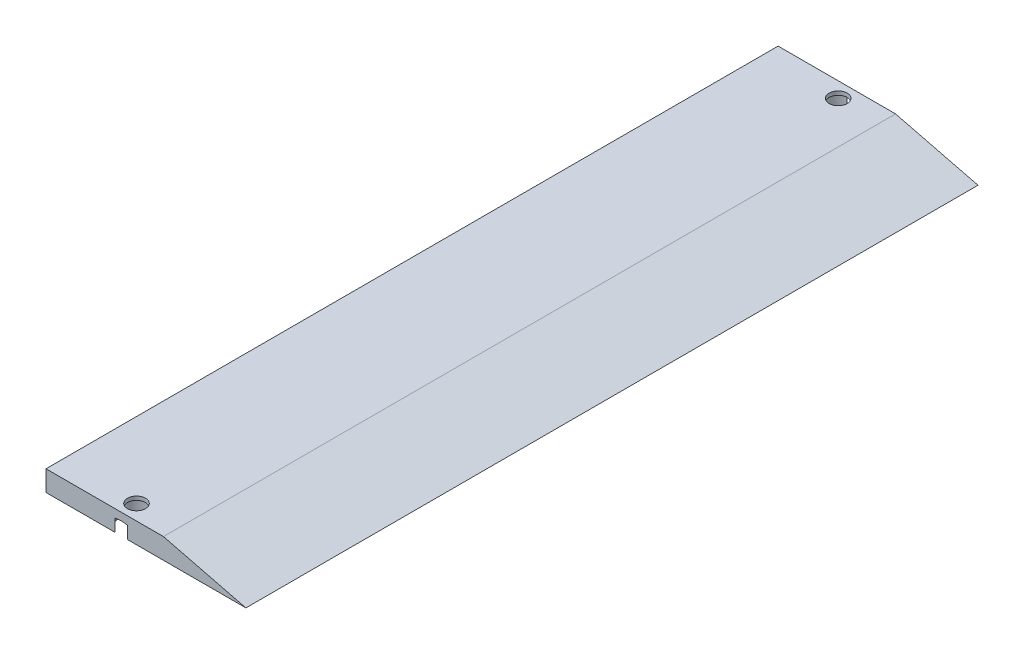
ISO-10303-21;
HEADER;
FILE_DESCRIPTION(('STEP AP214'),'2;1');
FILE_NAME('part.step','',(''),(''),'','','');
FILE_SCHEMA(('AUTOMOTIVE_DESIGN { 1 0 10303 214 1 1 1 1 }'));
ENDSEC;
DATA;
#1=APPLICATION_CONTEXT('core data for automotive mechanical design processes');
#2=APPLICATION_PROTOCOL_DEFINITION('international standard','automotive_design',2000,#1);
#3=PRODUCT_CONTEXT('',#1,'mechanical');
#4=PRODUCT('Part','Part','',(#3));
#5=PRODUCT_RELATED_PRODUCT_CATEGORY('part','',(#4));
#6=PRODUCT_DEFINITION_FORMATION('','',#4);
#7=PRODUCT_DEFINITION_CONTEXT('part definition',#1,'design');
#8=PRODUCT_DEFINITION('design','',#6,#7);
#9=PRODUCT_DEFINITION_SHAPE('','',#8);
#10=(LENGTH_UNIT() NAMED_UNIT(*) SI_UNIT(.MILLI.,.METRE.));
#11=(NAMED_UNIT(*) PLANE_ANGLE_UNIT() SI_UNIT($,.RADIAN.));
#12=(NAMED_UNIT(*) SI_UNIT($,.STERADIAN.) SOLID_ANGLE_UNIT());
#13=UNCERTAINTY_MEASURE_WITH_UNIT(LENGTH_MEASURE(1.E-05),#10,'distance_accuracy_value','');
#14=(GEOMETRIC_REPRESENTATION_CONTEXT(3) GLOBAL_UNCERTAINTY_ASSIGNED_CONTEXT((#13)) GLOBAL_UNIT_ASSIGNED_CONTEXT((#10,
#11,#12)) REPRESENTATION_CONTEXT('',''));
#15=CARTESIAN_POINT('',(0.,0.,0.));
#16=DIRECTION('',(0.,0.,1.));
#17=DIRECTION('',(1.,0.,0.));
#18=AXIS2_PLACEMENT_3D('',#15,#16,#17);
#19=CARTESIAN_POINT('',(24.3,0.,44.5));
#20=DIRECTION('',(0.,1.,0.));
#21=DIRECTION('',(-1.,0.,0.));
#22=AXIS2_PLACEMENT_3D('',#19,#20,#21);
#23=PLANE('',#22);
#24=CARTESIAN_POINT('',(9.15,0.,42.65));
#25=DIRECTION('',(0.,-1.,0.));
#26=DIRECTION('',(0.,0.,-1.));
#27=AXIS2_PLACEMENT_3D('',#24,#25,#26);
#28=CIRCLE('',#27,2.);
#29=CARTESIAN_POINT('',(8.39006579232145,0.,44.5));
#30=VERTEX_POINT('',#29);
#31=CARTESIAN_POINT('',(9.90993420767854,0.,44.5));
#32=VERTEX_POINT('',#31);
#33=EDGE_CURVE('E108',#30,#32,#28,.T.);
#34=ORIENTED_EDGE('',*,*,#33,.F.);
#35=DIRECTION('',(1.,0.,0.));
#36=VECTOR('',#35,1.);
#37=CARTESIAN_POINT('',(24.3,0.,44.5));
#38=LINE('',#37,#36);
#39=CARTESIAN_POINT('',(0.,0.,44.5));
#40=VERTEX_POINT('',#39);
#41=EDGE_CURVE('E113',#40,#30,#38,.T.);
#42=ORIENTED_EDGE('',*,*,#41,.F.);
#43=DIRECTION('',(0.,0.,-1.));
#44=VECTOR('',#43,1.);
#45=CARTESIAN_POINT('',(0.,0.,44.5));
#46=LINE('',#45,#44);
#47=CARTESIAN_POINT('',(0.,0.,-44.5));
#48=VERTEX_POINT('',#47);
#49=EDGE_CURVE('E199',#40,#48,#46,.T.);
#50=ORIENTED_EDGE('',*,*,#49,.T.);
#51=DIRECTION('',(1.,0.,0.));
#52=VECTOR('',#51,1.);
#53=CARTESIAN_POINT('',(24.3,0.,-44.5));
#54=LINE('',#53,#52);
#55=CARTESIAN_POINT('',(8.39006579232145,0.,-44.5));
#56=VERTEX_POINT('',#55);
#57=EDGE_CURVE('E183',#48,#56,#54,.T.);
#58=ORIENTED_EDGE('',*,*,#57,.T.);
#59=CARTESIAN_POINT('',(9.15,0.,-42.65));
#60=DIRECTION('',(0.,-1.,0.));
#61=DIRECTION('',(0.,0.,-1.));
#62=AXIS2_PLACEMENT_3D('',#59,#60,#61);
#63=CIRCLE('',#62,2.);
#64=CARTESIAN_POINT('',(9.90993420767854,0.,-44.5));
#65=VERTEX_POINT('',#64);
#66=EDGE_CURVE('E230',#65,#56,#63,.T.);
#67=ORIENTED_EDGE('',*,*,#66,.F.);
#68=CARTESIAN_POINT('',(24.3,0.,-44.5));
#69=VERTEX_POINT('',#68);
#70=EDGE_CURVE('E210',#65,#69,#54,.T.);
#71=ORIENTED_EDGE('',*,*,#70,.T.);
#72=DIRECTION('',(0.,0.,-1.));
#73=VECTOR('',#72,1.);
#74=CARTESIAN_POINT('',(24.3,0.,44.5));
#75=LINE('',#74,#73);
#76=CARTESIAN_POINT('',(24.3,0.,44.5));
#77=VERTEX_POINT('',#76);
#78=EDGE_CURVE('E150',#77,#69,#75,.T.);
#79=ORIENTED_EDGE('',*,*,#78,.F.);
#80=EDGE_CURVE('E195',#32,#77,#38,.T.);
#81=ORIENTED_EDGE('',*,*,#80,.F.);
#82=EDGE_LOOP('',(#34,#42,#50,#58,#67,#71,#79,#81));
#83=FACE_BOUND('',#82,.T.);
#84=ADVANCED_FACE('F36',(#83),#23,.F.);
#85=CARTESIAN_POINT('',(14.2730476661604,2.5,44.5));
#86=DIRECTION('',(-0.241921895599668,-0.970295726275996,0.));
#87=DIRECTION('',(0.970295726275996,-0.241921895599668,0.));
#88=AXIS2_PLACEMENT_3D('',#85,#86,#87);
#89=PLANE('',#88);
#90=DIRECTION('',(-0.970295726275996,0.241921895599668,0.));
#91=VECTOR('',#90,1.);
#92=CARTESIAN_POINT('',(14.2730476661604,2.5,-44.5));
#93=LINE('',#92,#91);
#94=CARTESIAN_POINT('',(14.2730476661604,2.5,-44.5));
#95=VERTEX_POINT('',#94);
#96=EDGE_CURVE('E174',#69,#95,#93,.T.);
#97=ORIENTED_EDGE('',*,*,#96,.T.);
#98=DIRECTION('',(0.,0.,-1.));
#99=VECTOR('',#98,1.);
#100=CARTESIAN_POINT('',(14.2730476661604,2.5,44.5));
#101=LINE('',#100,#99);
#102=CARTESIAN_POINT('',(14.2730476661604,2.5,44.5));
#103=VERTEX_POINT('',#102);
#104=EDGE_CURVE('E177',#103,#95,#101,.T.);
#105=ORIENTED_EDGE('',*,*,#104,.F.);
#106=DIRECTION('',(-0.970295726275996,0.241921895599668,0.));
#107=VECTOR('',#106,1.);
#108=CARTESIAN_POINT('',(14.2730476661604,2.5,44.5));
#109=LINE('',#108,#107);
#110=EDGE_CURVE('E206',#77,#103,#109,.T.);
#111=ORIENTED_EDGE('',*,*,#110,.F.);
#112=ORIENTED_EDGE('',*,*,#78,.T.);
#113=EDGE_LOOP('',(#97,#105,#111,#112));
#114=FACE_BOUND('',#113,.T.);
#115=ADVANCED_FACE('F163',(#114),#89,.F.);
#116=CARTESIAN_POINT('',(0.,2.5,44.5));
#117=DIRECTION('',(0.,-1.,0.));
#118=DIRECTION('',(1.,0.,0.));
#119=AXIS2_PLACEMENT_3D('',#116,#117,#118);
#120=PLANE('',#119);
#121=CARTESIAN_POINT('',(9.15,2.5,42.65));
#122=DIRECTION('',(0.,-1.,0.));
#123=DIRECTION('',(1.,0.,0.));
#124=AXIS2_PLACEMENT_3D('',#121,#122,#123);
#125=CIRCLE('',#124,1.1);
#126=CARTESIAN_POINT('',(10.25,2.5,42.65));
#127=VERTEX_POINT('',#126);
#128=EDGE_CURVE('E227',#127,#127,#125,.T.);
#129=ORIENTED_EDGE('',*,*,#128,.T.);
#130=EDGE_LOOP('',(#129));
#131=FACE_BOUND('',#130,.T.);
#132=CARTESIAN_POINT('',(9.15,2.5,-42.65));
#133=DIRECTION('',(0.,-1.,0.));
#134=DIRECTION('',(1.,0.,0.));
#135=AXIS2_PLACEMENT_3D('',#132,#133,#134);
#136=CIRCLE('',#135,1.1);
#137=CARTESIAN_POINT('',(10.25,2.5,-42.65));
#138=VERTEX_POINT('',#137);
#139=EDGE_CURVE('E212',#138,#138,#136,.T.);
#140=ORIENTED_EDGE('',*,*,#139,.T.);
#141=EDGE_LOOP('',(#140));
#142=FACE_BOUND('',#141,.T.);
#143=DIRECTION('',(-1.,0.,0.));
#144=VECTOR('',#143,1.);
#145=CARTESIAN_POINT('',(0.,2.5,-44.5));
#146=LINE('',#145,#144);
#147=CARTESIAN_POINT('',(0.,2.5,-44.5));
#148=VERTEX_POINT('',#147);
#149=EDGE_CURVE('E182',#95,#148,#146,.T.);
#150=ORIENTED_EDGE('',*,*,#149,.T.);
#151=DIRECTION('',(0.,0.,-1.));
#152=VECTOR('',#151,1.);
#153=CARTESIAN_POINT('',(0.,2.5,44.5));
#154=LINE('',#153,#152);
#155=CARTESIAN_POINT('',(0.,2.5,44.5));
#156=VERTEX_POINT('',#155);
#157=EDGE_CURVE('E189',#156,#148,#154,.T.);
#158=ORIENTED_EDGE('',*,*,#157,.F.);
#159=DIRECTION('',(-1.,0.,0.));
#160=VECTOR('',#159,1.);
#161=CARTESIAN_POINT('',(0.,2.5,44.5));
#162=LINE('',#161,#160);
#163=EDGE_CURVE('E188',#103,#156,#162,.T.);
#164=ORIENTED_EDGE('',*,*,#163,.F.);
#165=ORIENTED_EDGE('',*,*,#104,.T.);
#166=EDGE_LOOP('',(#150,#158,#164,#165));
#167=FACE_BOUND('',#166,.T.);
#168=ADVANCED_FACE('F160',(#131,#142,#167),#120,.F.);
#169=CARTESIAN_POINT('',(0.,0.,44.5));
#170=DIRECTION('',(1.,0.,0.));
#171=DIRECTION('',(0.,0.,-1.));
#172=AXIS2_PLACEMENT_3D('',#169,#170,#171);
#173=PLANE('',#172);
#174=DIRECTION('',(0.,-1.,0.));
#175=VECTOR('',#174,1.);
#176=CARTESIAN_POINT('',(0.,0.,-44.5));
#177=LINE('',#176,#175);
#178=EDGE_CURVE('E193',#148,#48,#177,.T.);
#179=ORIENTED_EDGE('',*,*,#178,.T.);
#180=ORIENTED_EDGE('',*,*,#49,.F.);
#181=DIRECTION('',(0.,-1.,0.));
#182=VECTOR('',#181,1.);
#183=CARTESIAN_POINT('',(0.,0.,44.5));
#184=LINE('',#183,#182);
#185=EDGE_CURVE('E202',#156,#40,#184,.T.);
#186=ORIENTED_EDGE('',*,*,#185,.F.);
#187=ORIENTED_EDGE('',*,*,#157,.T.);
#188=EDGE_LOOP('',(#179,#180,#186,#187));
#189=FACE_BOUND('',#188,.T.);
#190=ADVANCED_FACE('F157',(#189),#173,.F.);
#191=CARTESIAN_POINT('',(0.,0.,44.5));
#192=DIRECTION('',(0.,0.,-1.));
#193=DIRECTION('',(-1.,0.,0.));
#194=AXIS2_PLACEMENT_3D('',#191,#192,#193);
#195=PLANE('',#194);
#196=CARTESIAN_POINT('',(6.59444238548207,0.806067907899815,44.5));
#197=CARTESIAN_POINT('',(6.6682645925823,0.841987536418596,44.5));
#198=CARTESIAN_POINT('',(6.7422923801491,0.877492518891963,44.5));
#199=CARTESIAN_POINT('',(6.89086107584432,0.947450063041663,44.5));
#200=CARTESIAN_POINT('',(6.96540208392856,0.981902412167576,44.5));
#201=CARTESIAN_POINT('',(7.11552606471736,1.04972316517353,44.5));
#202=CARTESIAN_POINT('',(7.19111261964096,1.08308367608442,44.5));
#203=CARTESIAN_POINT('',(7.34298026279594,1.14817569987937,44.5));
#204=CARTESIAN_POINT('',(7.41926131283884,1.17990730170351,44.5));
#205=CARTESIAN_POINT('',(7.57417174488263,1.24194735074,44.5));
#206=CARTESIAN_POINT('',(7.65281767325495,1.2722149998071,44.5));
#207=CARTESIAN_POINT('',(7.81108731294135,1.33006740940165,44.5));
#208=CARTESIAN_POINT('',(7.89071113507037,1.35765186265018,44.5));
#209=CARTESIAN_POINT('',(8.1308956011947,1.43522494455478,44.5));
#210=CARTESIAN_POINT('',(8.29320139498514,1.48021428056957,44.5));
#211=CARTESIAN_POINT('',(8.54646274004633,1.53353303693847,44.5));
#212=CARTESIAN_POINT('',(8.63586657377305,1.54920451548702,44.5));
#213=CARTESIAN_POINT('',(8.81566336213668,1.57334845963417,44.5));
#214=CARTESIAN_POINT('',(8.90605621485068,1.58182166010068,44.5));
#215=CARTESIAN_POINT('',(9.08622469975676,1.59076121335444,44.5));
#216=CARTESIAN_POINT('',(9.17599578946092,1.59131682336556,44.5));
#217=CARTESIAN_POINT('',(9.35524526981166,1.58460377310746,44.5));
#218=CARTESIAN_POINT('',(9.44472361659146,1.57733398965401,44.5));
#219=CARTESIAN_POINT('',(9.66358111852635,1.5506168392289,44.5));
#220=CARTESIAN_POINT('',(9.7924627475032,1.52711671576831,44.5));
#221=CARTESIAN_POINT('',(10.0474922796653,1.46827150248723,44.5));
#222=CARTESIAN_POINT('',(10.1736373958245,1.43291488962221,44.5));
#223=CARTESIAN_POINT('',(10.3623201051773,1.37311372311389,44.5));
#224=CARTESIAN_POINT('',(10.4258713288542,1.35175855272218,44.5));
#225=CARTESIAN_POINT('',(10.5523277071677,1.30720740948195,44.5));
#226=CARTESIAN_POINT('',(10.6152328562462,1.28401142081179,44.5));
#227=CARTESIAN_POINT('',(10.7404336144126,1.23610775500023,44.5));
#228=CARTESIAN_POINT('',(10.8027294458913,1.21140065523917,44.5));
#229=CARTESIAN_POINT('',(10.9267996975924,1.16072112966394,44.5));
#230=CARTESIAN_POINT('',(10.9885741383714,1.13474875401136,44.5));
#231=CARTESIAN_POINT('',(11.2032967424494,1.04231897698155,44.5));
#232=CARTESIAN_POINT('',(11.355076679947,0.973149165263977,44.5));
#233=CARTESIAN_POINT('',(11.6566631609112,0.830617009352424,44.5));
#234=CARTESIAN_POINT('',(11.8064692838507,0.757253788960367,44.5));
#235=CARTESIAN_POINT('',(12.1047324194077,0.607637131990832,44.5));
#236=CARTESIAN_POINT('',(12.253188622555,0.531382086967987,44.5));
#237=CARTESIAN_POINT('',(12.5490568063834,0.376868105969787,44.5));
#238=CARTESIAN_POINT('',(12.6964687482323,0.298609095968617,44.5));
#239=CARTESIAN_POINT('',(12.9908191140464,0.140472839545878,44.5));
#240=CARTESIAN_POINT('',(13.1377558960653,0.0605925429348834,44.5));
#241=CARTESIAN_POINT('',(13.4310316509055,-0.100259077095215,44.5));
#242=CARTESIAN_POINT('',(13.5773706184478,-0.181230410121667,44.5));
#243=CARTESIAN_POINT('',(14.015596097537,-0.425318798115221,44.5));
#244=CARTESIAN_POINT('',(14.3067962520312,-0.58966722454027,44.5));
#245=CARTESIAN_POINT('',(14.8448337566611,-0.895794407270467,44.5));
#246=CARTESIAN_POINT('',(15.0918296388874,-1.03729569465513,44.5));
#247=CARTESIAN_POINT('',(15.5852500642677,-1.32135089141933,44.5));
#248=CARTESIAN_POINT('',(15.8316745443308,-1.46390491038304,44.5));
#249=CARTESIAN_POINT('',(16.3231603592293,-1.74922120452498,44.5));
#250=CARTESIAN_POINT('',(16.5682233296152,-1.89198066562047,44.5));
#251=CARTESIAN_POINT('',(17.0579895901374,-2.17805114711455,44.5));
#252=CARTESIAN_POINT('',(17.3026929182433,-2.32136210248978,44.5));
#253=CARTESIAN_POINT('',(17.5472801898519,-2.46487006850865,44.5));
#254=B_SPLINE_CURVE_WITH_KNOTS('',3,(#196,#197,#198,#199,#200,#201,#202,#203,#204,#205,#206,
#207,#208,#209,#210,#211,#212,#213,#214,#215,#216,#217,#218,#219,#220,#221,#222,#223,#224,#225,
#226,#227,#228,#229,#230,#231,#232,#233,#234,#235,#236,#237,#238,#239,#240,#241,#242,#243,#244,
#245,#246,#247,#248,#249,#250,#251,#252,#253),.UNSPECIFIED.,.F.,.F.,(4,2,2,2,2,2,2,2,2,2,2,2,2,
2,2,2,2,2,2,2,2,2,2,2,2,2,2,2,4),(0.,0.246295127205871,0.492639662616952,0.740486724665851,
0.988320239588767,1.24107745765782,1.49386358742656,1.99803295705516,2.27009754075422,
2.54213434620322,2.81110194653903,3.08010815713201,3.47233686454723,3.86494788000543,
4.06605621685199,4.2671662823919,4.46819998012517,4.669225714397,5.16950181411883,
5.66988282963293,6.17054636303702,6.67122841754458,7.17296074563737,7.67469749472953,
8.6778124455629,9.53178108106438,10.3858399000068,11.2366770201399,12.0874167220371),.UNSPECIFIED.);
#255=CARTESIAN_POINT('',(8.39006579232146,1.5,44.5));
#256=VERTEX_POINT('',#255);
#257=CARTESIAN_POINT('',(9.90993420767854,1.5,44.5));
#258=VERTEX_POINT('',#257);
#259=EDGE_CURVE('E98',#256,#258,#254,.T.);
#260=ORIENTED_EDGE('',*,*,#259,.T.);
#261=DIRECTION('',(0.,-1.,0.));
#262=VECTOR('',#261,1.);
#263=CARTESIAN_POINT('',(9.90993420767854,0.,44.5));
#264=LINE('',#263,#262);
#265=EDGE_CURVE('E11',#258,#32,#264,.T.);
#266=ORIENTED_EDGE('',*,*,#265,.T.);
#267=ORIENTED_EDGE('',*,*,#80,.T.);
#268=ORIENTED_EDGE('',*,*,#110,.T.);
#269=ORIENTED_EDGE('',*,*,#163,.T.);
#270=ORIENTED_EDGE('',*,*,#185,.T.);
#271=ORIENTED_EDGE('',*,*,#41,.T.);
#272=DIRECTION('',(0.,-1.,0.));
#273=VECTOR('',#272,1.);
#274=CARTESIAN_POINT('',(8.39006579232146,0.,44.5));
#275=LINE('',#274,#273);
#276=EDGE_CURVE('E43',#30,#256,#275,.F.);
#277=ORIENTED_EDGE('',*,*,#276,.T.);
#278=EDGE_LOOP('',(#260,#266,#267,#268,#269,#270,#271,#277));
#279=FACE_BOUND('',#278,.T.);
#280=ADVANCED_FACE('F111',(#279),#195,.F.);
#281=CARTESIAN_POINT('',(0.,0.,-44.5));
#282=DIRECTION('',(0.,0.,-1.));
#283=DIRECTION('',(-1.,0.,0.));
#284=AXIS2_PLACEMENT_3D('',#281,#282,#283);
#285=PLANE('',#284);
#286=DIRECTION('',(0.,-1.,0.));
#287=VECTOR('',#286,1.);
#288=CARTESIAN_POINT('',(9.90993420767854,0.,-44.5));
#289=LINE('',#288,#287);
#290=CARTESIAN_POINT('',(9.90993420767854,1.5,-44.5));
#291=VERTEX_POINT('',#290);
#292=EDGE_CURVE('E102',#291,#65,#289,.T.);
#293=ORIENTED_EDGE('',*,*,#292,.F.);
#294=CARTESIAN_POINT('',(6.59444238548207,0.806067907899815,-44.5));
#295=CARTESIAN_POINT('',(6.6682645925823,0.841987536418596,-44.5));
#296=CARTESIAN_POINT('',(6.7422923801491,0.877492518891963,-44.5));
#297=CARTESIAN_POINT('',(6.89086107584432,0.947450063041663,-44.5));
#298=CARTESIAN_POINT('',(6.96540208392856,0.981902412167576,-44.5));
#299=CARTESIAN_POINT('',(7.11552606471736,1.04972316517353,-44.5));
#300=CARTESIAN_POINT('',(7.19111261964096,1.08308367608442,-44.5));
#301=CARTESIAN_POINT('',(7.34298026279594,1.14817569987937,-44.5));
#302=CARTESIAN_POINT('',(7.41926131283884,1.17990730170351,-44.5));
#303=CARTESIAN_POINT('',(7.57417174488263,1.24194735074,-44.5));
#304=CARTESIAN_POINT('',(7.65281767325495,1.2722149998071,-44.5));
#305=CARTESIAN_POINT('',(7.81108731294135,1.33006740940165,-44.5));
#306=CARTESIAN_POINT('',(7.89071113507037,1.35765186265018,-44.5));
#307=CARTESIAN_POINT('',(8.1308956011947,1.43522494455478,-44.5));
#308=CARTESIAN_POINT('',(8.29320139498514,1.48021428056957,-44.5));
#309=CARTESIAN_POINT('',(8.54646274004633,1.53353303693847,-44.5));
#310=CARTESIAN_POINT('',(8.63586657377305,1.54920451548702,-44.5));
#311=CARTESIAN_POINT('',(8.81566336213668,1.57334845963417,-44.5));
#312=CARTESIAN_POINT('',(8.90605621485068,1.58182166010068,-44.5));
#313=CARTESIAN_POINT('',(9.08622469975676,1.59076121335444,-44.5));
#314=CARTESIAN_POINT('',(9.17599578946092,1.59131682336556,-44.5));
#315=CARTESIAN_POINT('',(9.35524526981166,1.58460377310746,-44.5));
#316=CARTESIAN_POINT('',(9.44472361659146,1.57733398965401,-44.5));
#317=CARTESIAN_POINT('',(9.66358111852635,1.5506168392289,-44.5));
#318=CARTESIAN_POINT('',(9.7924627475032,1.52711671576831,-44.5));
#319=CARTESIAN_POINT('',(10.0474922796653,1.46827150248723,-44.5));
#320=CARTESIAN_POINT('',(10.1736373958245,1.43291488962221,-44.5));
#321=CARTESIAN_POINT('',(10.3623201051773,1.37311372311389,-44.5));
#322=CARTESIAN_POINT('',(10.4258713288542,1.35175855272218,-44.5));
#323=CARTESIAN_POINT('',(10.5523277071677,1.30720740948195,-44.5));
#324=CARTESIAN_POINT('',(10.6152328562462,1.28401142081179,-44.5));
#325=CARTESIAN_POINT('',(10.7404336144126,1.23610775500023,-44.5));
#326=CARTESIAN_POINT('',(10.8027294458913,1.21140065523917,-44.5));
#327=CARTESIAN_POINT('',(10.9267996975924,1.16072112966394,-44.5));
#328=CARTESIAN_POINT('',(10.9885741383714,1.13474875401136,-44.5));
#329=CARTESIAN_POINT('',(11.2032967424494,1.04231897698155,-44.5));
#330=CARTESIAN_POINT('',(11.355076679947,0.973149165263977,-44.5));
#331=CARTESIAN_POINT('',(11.6566631609112,0.830617009352424,-44.5));
#332=CARTESIAN_POINT('',(11.8064692838507,0.757253788960367,-44.5));
#333=CARTESIAN_POINT('',(12.1047324194077,0.607637131990832,-44.5));
#334=CARTESIAN_POINT('',(12.253188622555,0.531382086967987,-44.5));
#335=CARTESIAN_POINT('',(12.5490568063834,0.376868105969787,-44.5));
#336=CARTESIAN_POINT('',(12.6964687482323,0.298609095968617,-44.5));
#337=CARTESIAN_POINT('',(12.9908191140464,0.140472839545878,-44.5));
#338=CARTESIAN_POINT('',(13.1377558960653,0.0605925429348834,-44.5));
#339=CARTESIAN_POINT('',(13.4310316509055,-0.100259077095215,-44.5));
#340=CARTESIAN_POINT('',(13.5773706184478,-0.181230410121667,-44.5));
#341=CARTESIAN_POINT('',(14.015596097537,-0.425318798115221,-44.5));
#342=CARTESIAN_POINT('',(14.3067962520312,-0.58966722454027,-44.5));
#343=CARTESIAN_POINT('',(14.8448337566611,-0.895794407270467,-44.5));
#344=CARTESIAN_POINT('',(15.0918296388874,-1.03729569465513,-44.5));
#345=CARTESIAN_POINT('',(15.5852500642677,-1.32135089141933,-44.5));
#346=CARTESIAN_POINT('',(15.8316745443308,-1.46390491038304,-44.5));
#347=CARTESIAN_POINT('',(16.3231603592293,-1.74922120452498,-44.5));
#348=CARTESIAN_POINT('',(16.5682233296152,-1.89198066562047,-44.5));
#349=CARTESIAN_POINT('',(17.0579895901374,-2.17805114711455,-44.5));
#350=CARTESIAN_POINT('',(17.3026929182433,-2.32136210248978,-44.5));
#351=CARTESIAN_POINT('',(17.5472801898519,-2.46487006850865,-44.5));
#352=B_SPLINE_CURVE_WITH_KNOTS('',3,(#294,#295,#296,#297,#298,#299,#300,#301,#302,#303,#304,
#305,#306,#307,#308,#309,#310,#311,#312,#313,#314,#315,#316,#317,#318,#319,#320,#321,#322,#323,
#324,#325,#326,#327,#328,#329,#330,#331,#332,#333,#334,#335,#336,#337,#338,#339,#340,#341,#342,
#343,#344,#345,#346,#347,#348,#349,#350,#351),.UNSPECIFIED.,.F.,.F.,(4,2,2,2,2,2,2,2,2,2,2,2,2,
2,2,2,2,2,2,2,2,2,2,2,2,2,2,2,4),(0.,0.246295127205871,0.492639662616952,0.740486724665851,
0.988320239588767,1.24107745765782,1.49386358742656,1.99803295705516,2.27009754075422,
2.54213434620322,2.81110194653903,3.08010815713201,3.47233686454723,3.86494788000543,
4.06605621685199,4.2671662823919,4.46819998012517,4.669225714397,5.16950181411883,
5.66988282963293,6.17054636303702,6.67122841754458,7.17296074563737,7.67469749472953,
8.6778124455629,9.53178108106438,10.3858399000068,11.2366770201399,12.0874167220371),.UNSPECIFIED.);
#353=CARTESIAN_POINT('',(8.39006579232146,1.5,-44.5));
#354=VERTEX_POINT('',#353);
#355=EDGE_CURVE('E143',#354,#291,#352,.T.);
#356=ORIENTED_EDGE('',*,*,#355,.F.);
#357=DIRECTION('',(0.,-1.,0.));
#358=VECTOR('',#357,1.);
#359=CARTESIAN_POINT('',(8.39006579232146,0.,-44.5));
#360=LINE('',#359,#358);
#361=EDGE_CURVE('E149',#56,#354,#360,.F.);
#362=ORIENTED_EDGE('',*,*,#361,.F.);
#363=ORIENTED_EDGE('',*,*,#57,.F.);
#364=ORIENTED_EDGE('',*,*,#178,.F.);
#365=ORIENTED_EDGE('',*,*,#149,.F.);
#366=ORIENTED_EDGE('',*,*,#96,.F.);
#367=ORIENTED_EDGE('',*,*,#70,.F.);
#368=EDGE_LOOP('',(#293,#356,#362,#363,#364,#365,#366,#367));
#369=FACE_BOUND('',#368,.T.);
#370=ADVANCED_FACE('F152',(#369),#285,.T.);
#371=CARTESIAN_POINT('',(9.15,0.,-42.65));
#372=DIRECTION('',(0.,-1.,0.));
#373=DIRECTION('',(0.,0.,-1.));
#374=AXIS2_PLACEMENT_3D('',#371,#372,#373);
#375=CYLINDRICAL_SURFACE('',#374,1.1);
#376=ORIENTED_EDGE('',*,*,#139,.F.);
#377=EDGE_LOOP('',(#376));
#378=FACE_BOUND('',#377,.T.);
#379=CARTESIAN_POINT('',(9.15,2.0407745571248,-42.65));
#380=DIRECTION('',(0.,-1.,0.));
#381=DIRECTION('',(0.,0.,-1.));
#382=AXIS2_PLACEMENT_3D('',#379,#380,#381);
#383=CIRCLE('',#382,1.1);
#384=CARTESIAN_POINT('',(9.15,2.0407745571248,-43.75));
#385=VERTEX_POINT('',#384);
#386=EDGE_CURVE('E214',#385,#385,#383,.T.);
#387=ORIENTED_EDGE('',*,*,#386,.T.);
#388=EDGE_LOOP('',(#387));
#389=FACE_BOUND('',#388,.T.);
#390=ADVANCED_FACE('F141',(#378,#389),#375,.F.);
#391=CARTESIAN_POINT('',(9.15,1.5,-42.65));
#392=DIRECTION('',(0.,-1.,0.));
#393=DIRECTION('',(0.,0.,-1.));
#394=AXIS2_PLACEMENT_3D('',#391,#392,#393);
#395=CONICAL_SURFACE('',#394,2.,1.02974425867666);
#396=ORIENTED_EDGE('',*,*,#355,.T.);
#397=CARTESIAN_POINT('',(9.15,1.5,-42.65));
#398=DIRECTION('',(0.,-1.,0.));
#399=DIRECTION('',(0.,0.,-1.));
#400=AXIS2_PLACEMENT_3D('',#397,#398,#399);
#401=CIRCLE('',#400,2.);
#402=EDGE_CURVE('E56',#291,#354,#401,.T.);
#403=ORIENTED_EDGE('',*,*,#402,.T.);
#404=EDGE_LOOP('',(#396,#403));
#405=FACE_BOUND('',#404,.T.);
#406=ORIENTED_EDGE('',*,*,#386,.F.);
#407=EDGE_LOOP('',(#406));
#408=FACE_BOUND('',#407,.T.);
#409=ADVANCED_FACE('F137',(#405,#408),#395,.F.);
#410=CARTESIAN_POINT('',(9.15,0.,-42.65));
#411=DIRECTION('',(0.,-1.,0.));
#412=DIRECTION('',(0.,0.,-1.));
#413=AXIS2_PLACEMENT_3D('',#410,#411,#412);
#414=CYLINDRICAL_SURFACE('',#413,2.);
#415=ORIENTED_EDGE('',*,*,#292,.T.);
#416=ORIENTED_EDGE('',*,*,#66,.T.);
#417=ORIENTED_EDGE('',*,*,#361,.T.);
#418=ORIENTED_EDGE('',*,*,#402,.F.);
#419=EDGE_LOOP('',(#415,#416,#417,#418));
#420=FACE_BOUND('',#419,.T.);
#421=ADVANCED_FACE('F134',(#420),#414,.F.);
#422=CARTESIAN_POINT('',(9.15,0.,42.65));
#423=DIRECTION('',(0.,-1.,0.));
#424=DIRECTION('',(0.,0.,-1.));
#425=AXIS2_PLACEMENT_3D('',#422,#423,#424);
#426=CYLINDRICAL_SURFACE('',#425,2.);
#427=CARTESIAN_POINT('',(9.15,1.5,42.65));
#428=DIRECTION('',(0.,-1.,0.));
#429=DIRECTION('',(0.,0.,-1.));
#430=AXIS2_PLACEMENT_3D('',#427,#428,#429);
#431=CIRCLE('',#430,2.);
#432=EDGE_CURVE('E49',#256,#258,#431,.T.);
#433=ORIENTED_EDGE('',*,*,#432,.F.);
#434=ORIENTED_EDGE('',*,*,#276,.F.);
#435=ORIENTED_EDGE('',*,*,#33,.T.);
#436=ORIENTED_EDGE('',*,*,#265,.F.);
#437=EDGE_LOOP('',(#433,#434,#435,#436));
#438=FACE_BOUND('',#437,.T.);
#439=ADVANCED_FACE('F105',(#438),#426,.F.);
#440=CARTESIAN_POINT('',(9.15,1.5,42.65));
#441=DIRECTION('',(0.,-1.,0.));
#442=DIRECTION('',(0.,0.,-1.));
#443=AXIS2_PLACEMENT_3D('',#440,#441,#442);
#444=CONICAL_SURFACE('',#443,2.,1.02974425867666);
#445=CARTESIAN_POINT('',(9.15,2.0407745571248,42.65));
#446=DIRECTION('',(0.,-1.,0.));
#447=DIRECTION('',(0.,0.,-1.));
#448=AXIS2_PLACEMENT_3D('',#445,#446,#447);
#449=CIRCLE('',#448,1.1);
#450=CARTESIAN_POINT('',(9.15,2.0407745571248,41.55));
#451=VERTEX_POINT('',#450);
#452=EDGE_CURVE('E107',#451,#451,#449,.T.);
#453=ORIENTED_EDGE('',*,*,#452,.F.);
#454=EDGE_LOOP('',(#453));
#455=FACE_BOUND('',#454,.T.);
#456=ORIENTED_EDGE('',*,*,#432,.T.);
#457=ORIENTED_EDGE('',*,*,#259,.F.);
#458=EDGE_LOOP('',(#456,#457));
#459=FACE_BOUND('',#458,.T.);
#460=ADVANCED_FACE('F99',(#455,#459),#444,.F.);
#461=CARTESIAN_POINT('',(9.15,0.,42.65));
#462=DIRECTION('',(0.,-1.,0.));
#463=DIRECTION('',(0.,0.,-1.));
#464=AXIS2_PLACEMENT_3D('',#461,#462,#463);
#465=CYLINDRICAL_SURFACE('',#464,1.1);
#466=ORIENTED_EDGE('',*,*,#128,.F.);
#467=EDGE_LOOP('',(#466));
#468=FACE_BOUND('',#467,.T.);
#469=ORIENTED_EDGE('',*,*,#452,.T.);
#470=EDGE_LOOP('',(#469));
#471=FACE_BOUND('',#470,.T.);
#472=ADVANCED_FACE('F129',(#468,#471),#465,.F.);
#473=CLOSED_SHELL('',(#84,#115,#168,#190,#280,#370,#390,#409,#421,#439,#460,#472));
#474=MANIFOLD_SOLID_BREP('B2',#473);
#475=ADVANCED_BREP_SHAPE_REPRESENTATION('',(#18,#474),#14);
#476=SHAPE_DEFINITION_REPRESENTATION(#9,#475);
ENDSEC;
END-ISO-10303-21;
